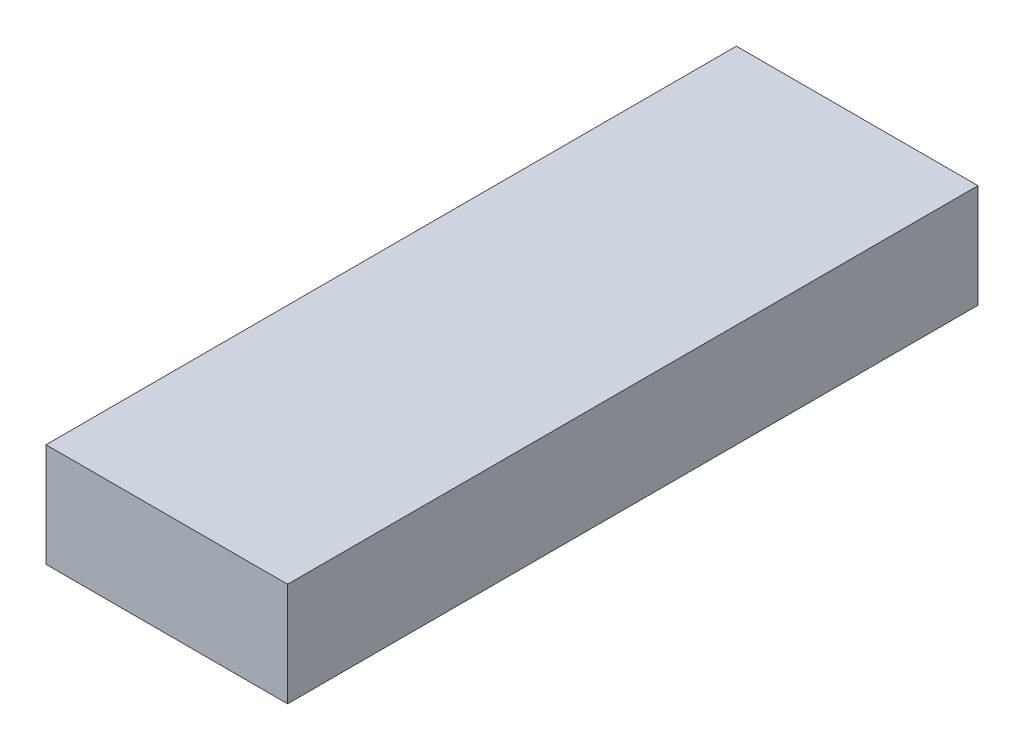
ISO-10303-21;
HEADER;
FILE_DESCRIPTION(('STEP AP214'),'2;1');
FILE_NAME('part.step','',(''),(''),'','','');
FILE_SCHEMA(('AUTOMOTIVE_DESIGN { 1 0 10303 214 1 1 1 1 }'));
ENDSEC;
DATA;
#1=APPLICATION_CONTEXT('core data for automotive mechanical design processes');
#2=APPLICATION_PROTOCOL_DEFINITION('international standard','automotive_design',2000,#1);
#3=PRODUCT_CONTEXT('',#1,'mechanical');
#4=PRODUCT('Part','Part','',(#3));
#5=PRODUCT_RELATED_PRODUCT_CATEGORY('part','',(#4));
#6=PRODUCT_DEFINITION_FORMATION('','',#4);
#7=PRODUCT_DEFINITION_CONTEXT('part definition',#1,'design');
#8=PRODUCT_DEFINITION('design','',#6,#7);
#9=PRODUCT_DEFINITION_SHAPE('','',#8);
#10=(LENGTH_UNIT() NAMED_UNIT(*) SI_UNIT(.MILLI.,.METRE.));
#11=(NAMED_UNIT(*) PLANE_ANGLE_UNIT() SI_UNIT($,.RADIAN.));
#12=(NAMED_UNIT(*) SI_UNIT($,.STERADIAN.) SOLID_ANGLE_UNIT());
#13=UNCERTAINTY_MEASURE_WITH_UNIT(LENGTH_MEASURE(1.E-05),#10,'distance_accuracy_value','');
#14=(GEOMETRIC_REPRESENTATION_CONTEXT(3) GLOBAL_UNCERTAINTY_ASSIGNED_CONTEXT((#13)) GLOBAL_UNIT_ASSIGNED_CONTEXT((#10,
#11,#12)) REPRESENTATION_CONTEXT('',''));
#15=CARTESIAN_POINT('',(0.,0.,0.));
#16=DIRECTION('',(0.,0.,1.));
#17=DIRECTION('',(1.,0.,0.));
#18=AXIS2_PLACEMENT_3D('',#15,#16,#17);
#19=CARTESIAN_POINT('',(350.,300.,1000.));
#20=DIRECTION('',(-1.,0.,0.));
#21=DIRECTION('',(0.,0.,1.));
#22=AXIS2_PLACEMENT_3D('',#19,#20,#21);
#23=PLANE('',#22);
#24=DIRECTION('',(0.,0.,-1.));
#25=VECTOR('',#24,1.);
#26=CARTESIAN_POINT('',(350.,0.,1000.));
#27=LINE('',#26,#25);
#28=CARTESIAN_POINT('',(350.,0.,1000.));
#29=VERTEX_POINT('',#28);
#30=CARTESIAN_POINT('',(350.,0.,-1000.));
#31=VERTEX_POINT('',#30);
#32=EDGE_CURVE('E96',#29,#31,#27,.T.);
#33=ORIENTED_EDGE('',*,*,#32,.T.);
#34=DIRECTION('',(0.,-1.,0.));
#35=VECTOR('',#34,1.);
#36=CARTESIAN_POINT('',(350.,300.,-1000.));
#37=LINE('',#36,#35);
#38=CARTESIAN_POINT('',(350.,300.,-1000.));
#39=VERTEX_POINT('',#38);
#40=EDGE_CURVE('E11',#39,#31,#37,.T.);
#41=ORIENTED_EDGE('',*,*,#40,.F.);
#42=DIRECTION('',(0.,0.,-1.));
#43=VECTOR('',#42,1.);
#44=CARTESIAN_POINT('',(350.,300.,1000.));
#45=LINE('',#44,#43);
#46=CARTESIAN_POINT('',(350.,300.,1000.));
#47=VERTEX_POINT('',#46);
#48=EDGE_CURVE('E84',#47,#39,#45,.T.);
#49=ORIENTED_EDGE('',*,*,#48,.F.);
#50=DIRECTION('',(0.,-1.,0.));
#51=VECTOR('',#50,1.);
#52=CARTESIAN_POINT('',(350.,300.,1000.));
#53=LINE('',#52,#51);
#54=EDGE_CURVE('E92',#47,#29,#53,.T.);
#55=ORIENTED_EDGE('',*,*,#54,.T.);
#56=EDGE_LOOP('',(#33,#41,#49,#55));
#57=FACE_BOUND('',#56,.T.);
#58=ADVANCED_FACE('F33',(#57),#23,.F.);
#59=CARTESIAN_POINT('',(-350.,300.,-1000.));
#60=DIRECTION('',(0.,0.,1.));
#61=DIRECTION('',(1.,0.,0.));
#62=AXIS2_PLACEMENT_3D('',#59,#60,#61);
#63=PLANE('',#62);
#64=DIRECTION('',(-1.,0.,0.));
#65=VECTOR('',#64,1.);
#66=CARTESIAN_POINT('',(-350.,0.,-1000.));
#67=LINE('',#66,#65);
#68=CARTESIAN_POINT('',(-350.,0.,-1000.));
#69=VERTEX_POINT('',#68);
#70=EDGE_CURVE('E88',#31,#69,#67,.T.);
#71=ORIENTED_EDGE('',*,*,#70,.T.);
#72=DIRECTION('',(0.,-1.,0.));
#73=VECTOR('',#72,1.);
#74=CARTESIAN_POINT('',(-350.,300.,-1000.));
#75=LINE('',#74,#73);
#76=CARTESIAN_POINT('',(-350.,300.,-1000.));
#77=VERTEX_POINT('',#76);
#78=EDGE_CURVE('E41',#77,#69,#75,.T.);
#79=ORIENTED_EDGE('',*,*,#78,.F.);
#80=DIRECTION('',(-1.,0.,0.));
#81=VECTOR('',#80,1.);
#82=CARTESIAN_POINT('',(-350.,300.,-1000.));
#83=LINE('',#82,#81);
#84=EDGE_CURVE('E79',#39,#77,#83,.T.);
#85=ORIENTED_EDGE('',*,*,#84,.F.);
#86=ORIENTED_EDGE('',*,*,#40,.T.);
#87=EDGE_LOOP('',(#71,#79,#85,#86));
#88=FACE_BOUND('',#87,.T.);
#89=ADVANCED_FACE('F87',(#88),#63,.F.);
#90=CARTESIAN_POINT('',(-350.,300.,1000.));
#91=DIRECTION('',(1.,0.,0.));
#92=DIRECTION('',(0.,0.,-1.));
#93=AXIS2_PLACEMENT_3D('',#90,#91,#92);
#94=PLANE('',#93);
#95=DIRECTION('',(0.,0.,1.));
#96=VECTOR('',#95,1.);
#97=CARTESIAN_POINT('',(-350.,0.,1000.));
#98=LINE('',#97,#96);
#99=CARTESIAN_POINT('',(-350.,0.,1000.));
#100=VERTEX_POINT('',#99);
#101=EDGE_CURVE('E66',#69,#100,#98,.T.);
#102=ORIENTED_EDGE('',*,*,#101,.T.);
#103=DIRECTION('',(0.,-1.,0.));
#104=VECTOR('',#103,1.);
#105=CARTESIAN_POINT('',(-350.,300.,1000.));
#106=LINE('',#105,#104);
#107=CARTESIAN_POINT('',(-350.,300.,1000.));
#108=VERTEX_POINT('',#107);
#109=EDGE_CURVE('E89',#108,#100,#106,.T.);
#110=ORIENTED_EDGE('',*,*,#109,.F.);
#111=DIRECTION('',(0.,0.,1.));
#112=VECTOR('',#111,1.);
#113=CARTESIAN_POINT('',(-350.,300.,1000.));
#114=LINE('',#113,#112);
#115=EDGE_CURVE('E82',#77,#108,#114,.T.);
#116=ORIENTED_EDGE('',*,*,#115,.F.);
#117=ORIENTED_EDGE('',*,*,#78,.T.);
#118=EDGE_LOOP('',(#102,#110,#116,#117));
#119=FACE_BOUND('',#118,.T.);
#120=ADVANCED_FACE('F90',(#119),#94,.F.);
#121=CARTESIAN_POINT('',(-350.,300.,1000.));
#122=DIRECTION('',(0.,0.,-1.));
#123=DIRECTION('',(-1.,0.,0.));
#124=AXIS2_PLACEMENT_3D('',#121,#122,#123);
#125=PLANE('',#124);
#126=DIRECTION('',(1.,0.,0.));
#127=VECTOR('',#126,1.);
#128=CARTESIAN_POINT('',(-350.,0.,1000.));
#129=LINE('',#128,#127);
#130=EDGE_CURVE('E72',#100,#29,#129,.T.);
#131=ORIENTED_EDGE('',*,*,#130,.T.);
#132=ORIENTED_EDGE('',*,*,#54,.F.);
#133=DIRECTION('',(1.,0.,0.));
#134=VECTOR('',#133,1.);
#135=CARTESIAN_POINT('',(-350.,300.,1000.));
#136=LINE('',#135,#134);
#137=EDGE_CURVE('E49',#108,#47,#136,.T.);
#138=ORIENTED_EDGE('',*,*,#137,.F.);
#139=ORIENTED_EDGE('',*,*,#109,.T.);
#140=EDGE_LOOP('',(#131,#132,#138,#139));
#141=FACE_BOUND('',#140,.T.);
#142=ADVANCED_FACE('F103',(#141),#125,.F.);
#143=CARTESIAN_POINT('',(0.,300.,0.));
#144=DIRECTION('',(0.,-1.,0.));
#145=DIRECTION('',(0.,0.,-1.));
#146=AXIS2_PLACEMENT_3D('',#143,#144,#145);
#147=PLANE('',#146);
#148=ORIENTED_EDGE('',*,*,#48,.T.);
#149=ORIENTED_EDGE('',*,*,#84,.T.);
#150=ORIENTED_EDGE('',*,*,#115,.T.);
#151=ORIENTED_EDGE('',*,*,#137,.T.);
#152=EDGE_LOOP('',(#148,#149,#150,#151));
#153=FACE_BOUND('',#152,.T.);
#154=ADVANCED_FACE('F80',(#153),#147,.F.);
#155=CARTESIAN_POINT('',(0.,0.,0.));
#156=DIRECTION('',(0.,-1.,0.));
#157=DIRECTION('',(0.,0.,-1.));
#158=AXIS2_PLACEMENT_3D('',#155,#156,#157);
#159=PLANE('',#158);
#160=ORIENTED_EDGE('',*,*,#32,.F.);
#161=ORIENTED_EDGE('',*,*,#130,.F.);
#162=ORIENTED_EDGE('',*,*,#101,.F.);
#163=ORIENTED_EDGE('',*,*,#70,.F.);
#164=EDGE_LOOP('',(#160,#161,#162,#163));
#165=FACE_BOUND('',#164,.T.);
#166=ADVANCED_FACE('F106',(#165),#159,.T.);
#167=CLOSED_SHELL('',(#58,#89,#120,#142,#154,#166));
#168=MANIFOLD_SOLID_BREP('B2',#167);
#169=ADVANCED_BREP_SHAPE_REPRESENTATION('',(#18,#168),#14);
#170=SHAPE_DEFINITION_REPRESENTATION(#9,#169);
ENDSEC;
END-ISO-10303-21;
